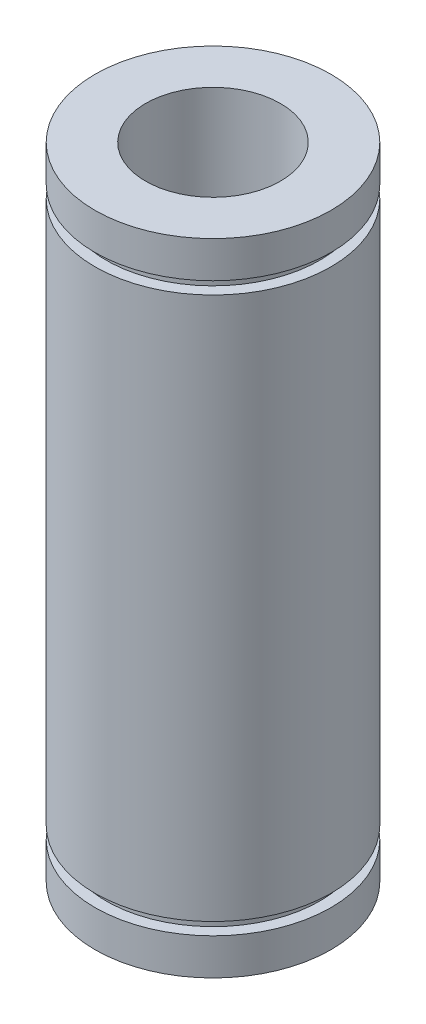
ISO-10303-21;
HEADER;
FILE_DESCRIPTION(('STEP AP214'),'2;1');
FILE_NAME('part.step','',(''),(''),'','','');
FILE_SCHEMA(('AUTOMOTIVE_DESIGN { 1 0 10303 214 1 1 1 1 }'));
ENDSEC;
DATA;
#1=APPLICATION_CONTEXT('core data for automotive mechanical design processes');
#2=APPLICATION_PROTOCOL_DEFINITION('international standard','automotive_design',2000,#1);
#3=PRODUCT_CONTEXT('',#1,'mechanical');
#4=PRODUCT('Part','Part','',(#3));
#5=PRODUCT_RELATED_PRODUCT_CATEGORY('part','',(#4));
#6=PRODUCT_DEFINITION_FORMATION('','',#4);
#7=PRODUCT_DEFINITION_CONTEXT('part definition',#1,'design');
#8=PRODUCT_DEFINITION('design','',#6,#7);
#9=PRODUCT_DEFINITION_SHAPE('','',#8);
#10=(LENGTH_UNIT() NAMED_UNIT(*) SI_UNIT(.MILLI.,.METRE.));
#11=(NAMED_UNIT(*) PLANE_ANGLE_UNIT() SI_UNIT($,.RADIAN.));
#12=(NAMED_UNIT(*) SI_UNIT($,.STERADIAN.) SOLID_ANGLE_UNIT());
#13=UNCERTAINTY_MEASURE_WITH_UNIT(LENGTH_MEASURE(1.E-05),#10,'distance_accuracy_value','');
#14=(GEOMETRIC_REPRESENTATION_CONTEXT(3) GLOBAL_UNCERTAINTY_ASSIGNED_CONTEXT((#13)) GLOBAL_UNIT_ASSIGNED_CONTEXT((#10,
#11,#12)) REPRESENTATION_CONTEXT('',''));
#15=CARTESIAN_POINT('',(0.,0.,0.));
#16=DIRECTION('',(0.,0.,1.));
#17=DIRECTION('',(1.,0.,0.));
#18=AXIS2_PLACEMENT_3D('',#15,#16,#17);
#19=CARTESIAN_POINT('',(0.,0.,0.));
#20=DIRECTION('',(0.,-1.,0.));
#21=DIRECTION('',(0.,0.,-1.));
#22=AXIS2_PLACEMENT_3D('',#19,#20,#21);
#23=CYLINDRICAL_SURFACE('',#22,6.);
#24=CARTESIAN_POINT('',(0.,12.,0.));
#25=DIRECTION('',(0.,-1.,0.));
#26=DIRECTION('',(0.,0.,-1.));
#27=AXIS2_PLACEMENT_3D('',#24,#25,#26);
#28=CIRCLE('',#27,6.);
#29=CARTESIAN_POINT('',(0.,12.,-6.));
#30=VERTEX_POINT('',#29);
#31=EDGE_CURVE('E10',#30,#30,#28,.T.);
#32=ORIENTED_EDGE('',*,*,#31,.F.);
#33=EDGE_LOOP('',(#32));
#34=FACE_BOUND('',#33,.T.);
#35=CARTESIAN_POINT('',(0.,-45.,0.));
#36=DIRECTION('',(0.,-1.,0.));
#37=DIRECTION('',(0.,0.,-1.));
#38=AXIS2_PLACEMENT_3D('',#35,#36,#37);
#39=CIRCLE('',#38,6.);
#40=CARTESIAN_POINT('',(0.,-45.,-6.));
#41=VERTEX_POINT('',#40);
#42=EDGE_CURVE('E68',#41,#41,#39,.T.);
#43=ORIENTED_EDGE('',*,*,#42,.T.);
#44=EDGE_LOOP('',(#43));
#45=FACE_BOUND('',#44,.T.);
#46=ADVANCED_FACE('F37',(#34,#45),#23,.F.);
#47=CARTESIAN_POINT('',(6.,12.,0.));
#48=DIRECTION('',(0.,1.,0.));
#49=DIRECTION('',(0.,0.,1.));
#50=AXIS2_PLACEMENT_3D('',#47,#48,#49);
#51=PLANE('',#50);
#52=ORIENTED_EDGE('',*,*,#31,.T.);
#53=EDGE_LOOP('',(#52));
#54=FACE_BOUND('',#53,.T.);
#55=CARTESIAN_POINT('',(0.,12.,0.));
#56=DIRECTION('',(0.,-1.,0.));
#57=DIRECTION('',(0.,0.,-1.));
#58=AXIS2_PLACEMENT_3D('',#55,#56,#57);
#59=CIRCLE('',#58,10.5);
#60=CARTESIAN_POINT('',(0.,12.,-10.5));
#61=VERTEX_POINT('',#60);
#62=EDGE_CURVE('E44',#61,#61,#59,.T.);
#63=ORIENTED_EDGE('',*,*,#62,.F.);
#64=EDGE_LOOP('',(#63));
#65=FACE_BOUND('',#64,.T.);
#66=ADVANCED_FACE('F112',(#54,#65),#51,.T.);
#67=CARTESIAN_POINT('',(0.,0.,0.));
#68=DIRECTION('',(0.,-1.,0.));
#69=DIRECTION('',(0.,0.,-1.));
#70=AXIS2_PLACEMENT_3D('',#67,#68,#69);
#71=CYLINDRICAL_SURFACE('',#70,10.5);
#72=ORIENTED_EDGE('',*,*,#62,.T.);
#73=EDGE_LOOP('',(#72));
#74=FACE_BOUND('',#73,.T.);
#75=CARTESIAN_POINT('',(0.,8.75,0.));
#76=DIRECTION('',(0.,-1.,0.));
#77=DIRECTION('',(0.,0.,-1.));
#78=AXIS2_PLACEMENT_3D('',#75,#76,#77);
#79=CIRCLE('',#78,10.5);
#80=CARTESIAN_POINT('',(0.,8.75,-10.5));
#81=VERTEX_POINT('',#80);
#82=EDGE_CURVE('E49',#81,#81,#79,.T.);
#83=ORIENTED_EDGE('',*,*,#82,.F.);
#84=EDGE_LOOP('',(#83));
#85=FACE_BOUND('',#84,.T.);
#86=ADVANCED_FACE('F117',(#74,#85),#71,.T.);
#87=CARTESIAN_POINT('',(10.5,8.75,0.));
#88=DIRECTION('',(0.,-1.,0.));
#89=DIRECTION('',(0.,0.,-1.));
#90=AXIS2_PLACEMENT_3D('',#87,#88,#89);
#91=PLANE('',#90);
#92=ORIENTED_EDGE('',*,*,#82,.T.);
#93=EDGE_LOOP('',(#92));
#94=FACE_BOUND('',#93,.T.);
#95=CARTESIAN_POINT('',(0.,8.75,0.));
#96=DIRECTION('',(0.,-1.,0.));
#97=DIRECTION('',(0.,0.,-1.));
#98=AXIS2_PLACEMENT_3D('',#95,#96,#97);
#99=CIRCLE('',#98,9.5);
#100=CARTESIAN_POINT('',(0.,8.75,-9.5));
#101=VERTEX_POINT('',#100);
#102=EDGE_CURVE('E54',#101,#101,#99,.T.);
#103=ORIENTED_EDGE('',*,*,#102,.F.);
#104=EDGE_LOOP('',(#103));
#105=FACE_BOUND('',#104,.T.);
#106=ADVANCED_FACE('F185',(#94,#105),#91,.T.);
#107=CARTESIAN_POINT('',(0.,0.,0.));
#108=DIRECTION('',(0.,-1.,0.));
#109=DIRECTION('',(0.,0.,-1.));
#110=AXIS2_PLACEMENT_3D('',#107,#108,#109);
#111=CYLINDRICAL_SURFACE('',#110,9.5);
#112=ORIENTED_EDGE('',*,*,#102,.T.);
#113=EDGE_LOOP('',(#112));
#114=FACE_BOUND('',#113,.T.);
#115=CARTESIAN_POINT('',(0.,7.65,0.));
#116=DIRECTION('',(0.,-1.,0.));
#117=DIRECTION('',(0.,0.,-1.));
#118=AXIS2_PLACEMENT_3D('',#115,#116,#117);
#119=CIRCLE('',#118,9.5);
#120=CARTESIAN_POINT('',(0.,7.65,-9.5));
#121=VERTEX_POINT('',#120);
#122=EDGE_CURVE('E60',#121,#121,#119,.T.);
#123=ORIENTED_EDGE('',*,*,#122,.F.);
#124=EDGE_LOOP('',(#123));
#125=FACE_BOUND('',#124,.T.);
#126=ADVANCED_FACE('F108',(#114,#125),#111,.T.);
#127=CARTESIAN_POINT('',(9.5,7.65,0.));
#128=DIRECTION('',(0.,1.,0.));
#129=DIRECTION('',(0.,0.,1.));
#130=AXIS2_PLACEMENT_3D('',#127,#128,#129);
#131=PLANE('',#130);
#132=ORIENTED_EDGE('',*,*,#122,.T.);
#133=EDGE_LOOP('',(#132));
#134=FACE_BOUND('',#133,.T.);
#135=CARTESIAN_POINT('',(0.,7.65,0.));
#136=DIRECTION('',(0.,-1.,0.));
#137=DIRECTION('',(0.,0.,-1.));
#138=AXIS2_PLACEMENT_3D('',#135,#136,#137);
#139=CIRCLE('',#138,10.5);
#140=CARTESIAN_POINT('',(0.,7.65,-10.5));
#141=VERTEX_POINT('',#140);
#142=EDGE_CURVE('E64',#141,#141,#139,.T.);
#143=ORIENTED_EDGE('',*,*,#142,.F.);
#144=EDGE_LOOP('',(#143));
#145=FACE_BOUND('',#144,.T.);
#146=ADVANCED_FACE('F98',(#134,#145),#131,.T.);
#147=CARTESIAN_POINT('',(0.,0.,0.));
#148=DIRECTION('',(0.,-1.,0.));
#149=DIRECTION('',(0.,0.,-1.));
#150=AXIS2_PLACEMENT_3D('',#147,#148,#149);
#151=CYLINDRICAL_SURFACE('',#150,10.5);
#152=ORIENTED_EDGE('',*,*,#142,.T.);
#153=EDGE_LOOP('',(#152));
#154=FACE_BOUND('',#153,.T.);
#155=CARTESIAN_POINT('',(0.,-40.65,0.));
#156=DIRECTION('',(0.,-1.,0.));
#157=DIRECTION('',(0.,0.,-1.));
#158=AXIS2_PLACEMENT_3D('',#155,#156,#157);
#159=CIRCLE('',#158,10.5);
#160=CARTESIAN_POINT('',(0.,-40.65,-10.5));
#161=VERTEX_POINT('',#160);
#162=EDGE_CURVE('E88',#161,#161,#159,.T.);
#163=ORIENTED_EDGE('',*,*,#162,.F.);
#164=EDGE_LOOP('',(#163));
#165=FACE_BOUND('',#164,.T.);
#166=ADVANCED_FACE('F95',(#154,#165),#151,.T.);
#167=CARTESIAN_POINT('',(6.,-45.,0.));
#168=DIRECTION('',(0.,-1.,0.));
#169=DIRECTION('',(0.,0.,1.));
#170=AXIS2_PLACEMENT_3D('',#167,#168,#169);
#171=PLANE('',#170);
#172=ORIENTED_EDGE('',*,*,#42,.F.);
#173=EDGE_LOOP('',(#172));
#174=FACE_BOUND('',#173,.T.);
#175=CARTESIAN_POINT('',(0.,-45.,0.));
#176=DIRECTION('',(0.,-1.,0.));
#177=DIRECTION('',(0.,0.,-1.));
#178=AXIS2_PLACEMENT_3D('',#175,#176,#177);
#179=CIRCLE('',#178,10.5);
#180=CARTESIAN_POINT('',(0.,-45.,-10.5));
#181=VERTEX_POINT('',#180);
#182=EDGE_CURVE('E72',#181,#181,#179,.T.);
#183=ORIENTED_EDGE('',*,*,#182,.T.);
#184=EDGE_LOOP('',(#183));
#185=FACE_BOUND('',#184,.T.);
#186=ADVANCED_FACE('F97',(#174,#185),#171,.T.);
#187=CARTESIAN_POINT('',(0.,-33.,0.));
#188=DIRECTION('',(0.,1.,0.));
#189=DIRECTION('',(0.,0.,-1.));
#190=AXIS2_PLACEMENT_3D('',#187,#188,#189);
#191=CYLINDRICAL_SURFACE('',#190,10.5);
#192=ORIENTED_EDGE('',*,*,#182,.F.);
#193=EDGE_LOOP('',(#192));
#194=FACE_BOUND('',#193,.T.);
#195=CARTESIAN_POINT('',(0.,-41.75,0.));
#196=DIRECTION('',(0.,-1.,0.));
#197=DIRECTION('',(0.,0.,-1.));
#198=AXIS2_PLACEMENT_3D('',#195,#196,#197);
#199=CIRCLE('',#198,10.5);
#200=CARTESIAN_POINT('',(0.,-41.75,-10.5));
#201=VERTEX_POINT('',#200);
#202=EDGE_CURVE('E76',#201,#201,#199,.T.);
#203=ORIENTED_EDGE('',*,*,#202,.T.);
#204=EDGE_LOOP('',(#203));
#205=FACE_BOUND('',#204,.T.);
#206=ADVANCED_FACE('F105',(#194,#205),#191,.T.);
#207=CARTESIAN_POINT('',(10.5,-41.75,0.));
#208=DIRECTION('',(0.,1.,0.));
#209=DIRECTION('',(0.,0.,-1.));
#210=AXIS2_PLACEMENT_3D('',#207,#208,#209);
#211=PLANE('',#210);
#212=ORIENTED_EDGE('',*,*,#202,.F.);
#213=EDGE_LOOP('',(#212));
#214=FACE_BOUND('',#213,.T.);
#215=CARTESIAN_POINT('',(0.,-41.75,0.));
#216=DIRECTION('',(0.,-1.,0.));
#217=DIRECTION('',(0.,0.,-1.));
#218=AXIS2_PLACEMENT_3D('',#215,#216,#217);
#219=CIRCLE('',#218,9.5);
#220=CARTESIAN_POINT('',(0.,-41.75,-9.5));
#221=VERTEX_POINT('',#220);
#222=EDGE_CURVE('E80',#221,#221,#219,.T.);
#223=ORIENTED_EDGE('',*,*,#222,.T.);
#224=EDGE_LOOP('',(#223));
#225=FACE_BOUND('',#224,.T.);
#226=ADVANCED_FACE('F125',(#214,#225),#211,.T.);
#227=CARTESIAN_POINT('',(0.,-33.,0.));
#228=DIRECTION('',(0.,1.,0.));
#229=DIRECTION('',(0.,0.,-1.));
#230=AXIS2_PLACEMENT_3D('',#227,#228,#229);
#231=CYLINDRICAL_SURFACE('',#230,9.5);
#232=ORIENTED_EDGE('',*,*,#222,.F.);
#233=EDGE_LOOP('',(#232));
#234=FACE_BOUND('',#233,.T.);
#235=CARTESIAN_POINT('',(0.,-40.65,0.));
#236=DIRECTION('',(0.,-1.,0.));
#237=DIRECTION('',(0.,0.,-1.));
#238=AXIS2_PLACEMENT_3D('',#235,#236,#237);
#239=CIRCLE('',#238,9.5);
#240=CARTESIAN_POINT('',(0.,-40.65,-9.5));
#241=VERTEX_POINT('',#240);
#242=EDGE_CURVE('E84',#241,#241,#239,.T.);
#243=ORIENTED_EDGE('',*,*,#242,.T.);
#244=EDGE_LOOP('',(#243));
#245=FACE_BOUND('',#244,.T.);
#246=ADVANCED_FACE('F131',(#234,#245),#231,.T.);
#247=CARTESIAN_POINT('',(9.5,-40.65,0.));
#248=DIRECTION('',(0.,-1.,0.));
#249=DIRECTION('',(0.,0.,1.));
#250=AXIS2_PLACEMENT_3D('',#247,#248,#249);
#251=PLANE('',#250);
#252=ORIENTED_EDGE('',*,*,#242,.F.);
#253=EDGE_LOOP('',(#252));
#254=FACE_BOUND('',#253,.T.);
#255=ORIENTED_EDGE('',*,*,#162,.T.);
#256=EDGE_LOOP('',(#255));
#257=FACE_BOUND('',#256,.T.);
#258=ADVANCED_FACE('F93',(#254,#257),#251,.T.);
#259=CLOSED_SHELL('',(#46,#66,#86,#106,#126,#146,#166,#186,#206,#226,#246,#258));
#260=MANIFOLD_SOLID_BREP('B2',#259);
#261=ADVANCED_BREP_SHAPE_REPRESENTATION('',(#18,#260),#14);
#262=SHAPE_DEFINITION_REPRESENTATION(#9,#261);
ENDSEC;
END-ISO-10303-21;
